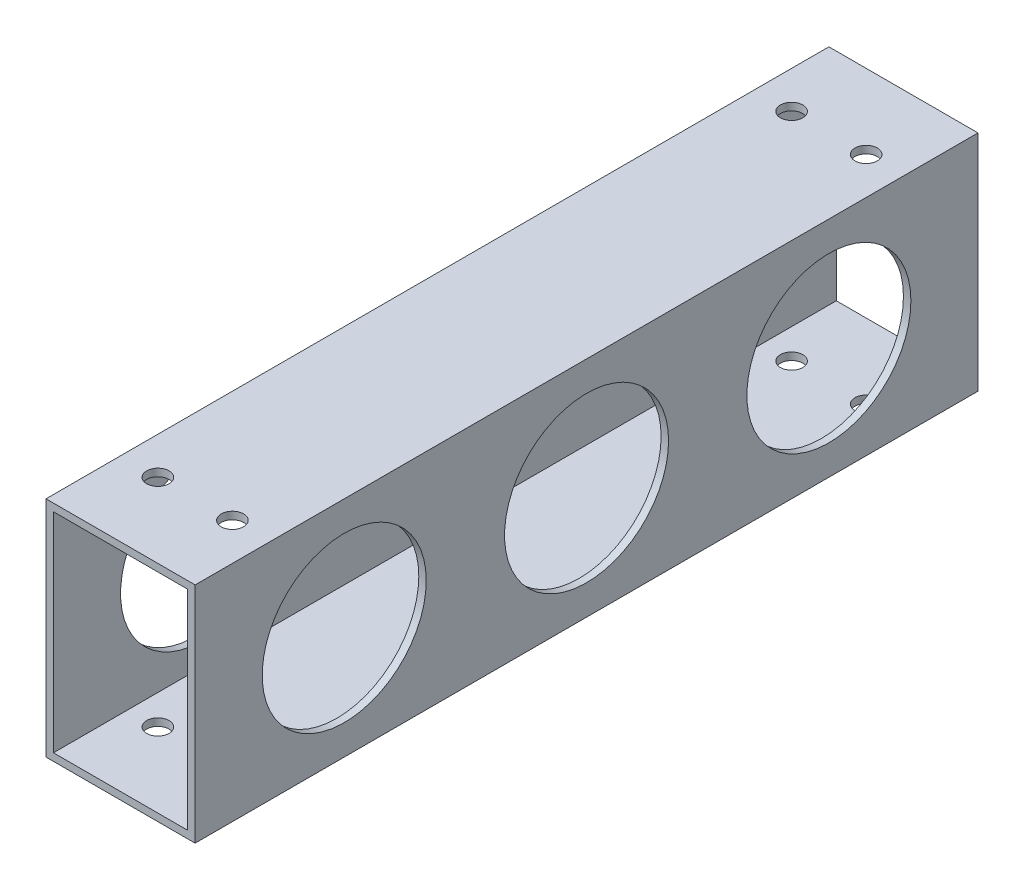
ISO-10303-21;
HEADER;
FILE_DESCRIPTION(('STEP AP214'),'2;1');
FILE_NAME('part.step','',(''),(''),'','','');
FILE_SCHEMA(('AUTOMOTIVE_DESIGN { 1 0 10303 214 1 1 1 1 }'));
ENDSEC;
DATA;
#1=APPLICATION_CONTEXT('core data for automotive mechanical design processes');
#2=APPLICATION_PROTOCOL_DEFINITION('international standard','automotive_design',2000,#1);
#3=PRODUCT_CONTEXT('',#1,'mechanical');
#4=PRODUCT('Part','Part','',(#3));
#5=PRODUCT_RELATED_PRODUCT_CATEGORY('part','',(#4));
#6=PRODUCT_DEFINITION_FORMATION('','',#4);
#7=PRODUCT_DEFINITION_CONTEXT('part definition',#1,'design');
#8=PRODUCT_DEFINITION('design','',#6,#7);
#9=PRODUCT_DEFINITION_SHAPE('','',#8);
#10=(LENGTH_UNIT() NAMED_UNIT(*) SI_UNIT(.MILLI.,.METRE.));
#11=(NAMED_UNIT(*) PLANE_ANGLE_UNIT() SI_UNIT($,.RADIAN.));
#12=(NAMED_UNIT(*) SI_UNIT($,.STERADIAN.) SOLID_ANGLE_UNIT());
#13=UNCERTAINTY_MEASURE_WITH_UNIT(LENGTH_MEASURE(1.E-05),#10,'distance_accuracy_value','');
#14=(GEOMETRIC_REPRESENTATION_CONTEXT(3) GLOBAL_UNCERTAINTY_ASSIGNED_CONTEXT((#13)) GLOBAL_UNIT_ASSIGNED_CONTEXT((#10,
#11,#12)) REPRESENTATION_CONTEXT('',''));
#15=CARTESIAN_POINT('',(0.,0.,0.));
#16=DIRECTION('',(0.,0.,1.));
#17=DIRECTION('',(1.,0.,0.));
#18=AXIS2_PLACEMENT_3D('',#15,#16,#17);
#19=CARTESIAN_POINT('',(0.,0.,105.));
#20=DIRECTION('',(0.,0.,1.));
#21=DIRECTION('',(1.,0.,0.));
#22=AXIS2_PLACEMENT_3D('',#19,#20,#21);
#23=PLANE('',#22);
#24=DIRECTION('',(0.,1.,0.));
#25=VECTOR('',#24,1.);
#26=CARTESIAN_POINT('',(9.99999999999999,-15.,105.));
#27=LINE('',#26,#25);
#28=CARTESIAN_POINT('',(9.99999999999999,-15.,105.));
#29=VERTEX_POINT('',#28);
#30=CARTESIAN_POINT('',(9.99999999999999,15.,105.));
#31=VERTEX_POINT('',#30);
#32=EDGE_CURVE('E173',#29,#31,#27,.T.);
#33=ORIENTED_EDGE('',*,*,#32,.T.);
#34=DIRECTION('',(-1.,0.,0.));
#35=VECTOR('',#34,1.);
#36=CARTESIAN_POINT('',(-10.,15.,105.));
#37=LINE('',#36,#35);
#38=CARTESIAN_POINT('',(-10.,15.,105.));
#39=VERTEX_POINT('',#38);
#40=EDGE_CURVE('E176',#31,#39,#37,.T.);
#41=ORIENTED_EDGE('',*,*,#40,.T.);
#42=DIRECTION('',(0.,-1.,0.));
#43=VECTOR('',#42,1.);
#44=CARTESIAN_POINT('',(-10.,-15.,105.));
#45=LINE('',#44,#43);
#46=CARTESIAN_POINT('',(-10.,-15.,105.));
#47=VERTEX_POINT('',#46);
#48=EDGE_CURVE('E179',#39,#47,#45,.T.);
#49=ORIENTED_EDGE('',*,*,#48,.T.);
#50=DIRECTION('',(1.,0.,0.));
#51=VECTOR('',#50,1.);
#52=CARTESIAN_POINT('',(-10.,-15.,105.));
#53=LINE('',#52,#51);
#54=EDGE_CURVE('E181',#47,#29,#53,.T.);
#55=ORIENTED_EDGE('',*,*,#54,.T.);
#56=EDGE_LOOP('',(#33,#41,#49,#55));
#57=FACE_BOUND('',#56,.T.);
#58=DIRECTION('',(-1.,0.,0.));
#59=VECTOR('',#58,1.);
#60=CARTESIAN_POINT('',(0.,14.,105.));
#61=LINE('',#60,#59);
#62=CARTESIAN_POINT('',(8.99999999999999,14.,105.));
#63=VERTEX_POINT('',#62);
#64=CARTESIAN_POINT('',(-9.00000000000001,14.,105.));
#65=VERTEX_POINT('',#64);
#66=EDGE_CURVE('E143',#63,#65,#61,.T.);
#67=ORIENTED_EDGE('',*,*,#66,.F.);
#68=DIRECTION('',(0.,1.,0.));
#69=VECTOR('',#68,1.);
#70=CARTESIAN_POINT('',(8.99999999999999,0.,105.));
#71=LINE('',#70,#69);
#72=CARTESIAN_POINT('',(8.99999999999999,-14.,105.));
#73=VERTEX_POINT('',#72);
#74=EDGE_CURVE('E135',#73,#63,#71,.T.);
#75=ORIENTED_EDGE('',*,*,#74,.F.);
#76=DIRECTION('',(1.,0.,0.));
#77=VECTOR('',#76,1.);
#78=CARTESIAN_POINT('',(0.,-14.,105.));
#79=LINE('',#78,#77);
#80=CARTESIAN_POINT('',(-9.00000000000001,-14.,105.));
#81=VERTEX_POINT('',#80);
#82=EDGE_CURVE('E157',#81,#73,#79,.T.);
#83=ORIENTED_EDGE('',*,*,#82,.F.);
#84=DIRECTION('',(0.,-1.,0.));
#85=VECTOR('',#84,1.);
#86=CARTESIAN_POINT('',(-9.00000000000001,0.,105.));
#87=LINE('',#86,#85);
#88=EDGE_CURVE('E155',#65,#81,#87,.T.);
#89=ORIENTED_EDGE('',*,*,#88,.F.);
#90=EDGE_LOOP('',(#67,#75,#83,#89));
#91=FACE_BOUND('',#90,.T.);
#92=ADVANCED_FACE('F68',(#57,#91),#23,.T.);
#93=CARTESIAN_POINT('',(0.,0.,0.));
#94=DIRECTION('',(0.,0.,1.));
#95=DIRECTION('',(1.,0.,0.));
#96=AXIS2_PLACEMENT_3D('',#93,#94,#95);
#97=PLANE('',#96);
#98=DIRECTION('',(0.,1.,0.));
#99=VECTOR('',#98,1.);
#100=CARTESIAN_POINT('',(9.99999999999999,-15.,0.));
#101=LINE('',#100,#99);
#102=CARTESIAN_POINT('',(9.99999999999999,-15.,0.));
#103=VERTEX_POINT('',#102);
#104=CARTESIAN_POINT('',(9.99999999999999,15.,0.));
#105=VERTEX_POINT('',#104);
#106=EDGE_CURVE('E151',#103,#105,#101,.T.);
#107=ORIENTED_EDGE('',*,*,#106,.F.);
#108=DIRECTION('',(1.,0.,0.));
#109=VECTOR('',#108,1.);
#110=CARTESIAN_POINT('',(-10.,-15.,0.));
#111=LINE('',#110,#109);
#112=CARTESIAN_POINT('',(-10.,-15.,0.));
#113=VERTEX_POINT('',#112);
#114=EDGE_CURVE('E177',#113,#103,#111,.T.);
#115=ORIENTED_EDGE('',*,*,#114,.F.);
#116=DIRECTION('',(0.,-1.,0.));
#117=VECTOR('',#116,1.);
#118=CARTESIAN_POINT('',(-10.,-15.,0.));
#119=LINE('',#118,#117);
#120=CARTESIAN_POINT('',(-10.,15.,0.));
#121=VERTEX_POINT('',#120);
#122=EDGE_CURVE('E188',#121,#113,#119,.T.);
#123=ORIENTED_EDGE('',*,*,#122,.F.);
#124=DIRECTION('',(-1.,0.,0.));
#125=VECTOR('',#124,1.);
#126=CARTESIAN_POINT('',(-10.,15.,0.));
#127=LINE('',#126,#125);
#128=EDGE_CURVE('E186',#105,#121,#127,.T.);
#129=ORIENTED_EDGE('',*,*,#128,.F.);
#130=EDGE_LOOP('',(#107,#115,#123,#129));
#131=FACE_BOUND('',#130,.T.);
#132=DIRECTION('',(0.,1.,0.));
#133=VECTOR('',#132,1.);
#134=CARTESIAN_POINT('',(8.99999999999999,0.,0.));
#135=LINE('',#134,#133);
#136=CARTESIAN_POINT('',(8.99999999999999,-14.,0.));
#137=VERTEX_POINT('',#136);
#138=CARTESIAN_POINT('',(8.99999999999999,14.,0.));
#139=VERTEX_POINT('',#138);
#140=EDGE_CURVE('E93',#137,#139,#135,.T.);
#141=ORIENTED_EDGE('',*,*,#140,.T.);
#142=DIRECTION('',(-1.,0.,0.));
#143=VECTOR('',#142,1.);
#144=CARTESIAN_POINT('',(0.,14.,0.));
#145=LINE('',#144,#143);
#146=CARTESIAN_POINT('',(-9.00000000000001,14.,0.));
#147=VERTEX_POINT('',#146);
#148=EDGE_CURVE('E150',#139,#147,#145,.T.);
#149=ORIENTED_EDGE('',*,*,#148,.T.);
#150=DIRECTION('',(0.,-1.,0.));
#151=VECTOR('',#150,1.);
#152=CARTESIAN_POINT('',(-9.00000000000001,0.,0.));
#153=LINE('',#152,#151);
#154=CARTESIAN_POINT('',(-9.00000000000001,-14.,0.));
#155=VERTEX_POINT('',#154);
#156=EDGE_CURVE('E165',#147,#155,#153,.T.);
#157=ORIENTED_EDGE('',*,*,#156,.T.);
#158=DIRECTION('',(1.,0.,0.));
#159=VECTOR('',#158,1.);
#160=CARTESIAN_POINT('',(0.,-14.,0.));
#161=LINE('',#160,#159);
#162=EDGE_CURVE('E144',#155,#137,#161,.T.);
#163=ORIENTED_EDGE('',*,*,#162,.T.);
#164=EDGE_LOOP('',(#141,#149,#157,#163));
#165=FACE_BOUND('',#164,.T.);
#166=ADVANCED_FACE('F303',(#131,#165),#97,.F.);
#167=CARTESIAN_POINT('',(9.99999999999999,-15.,105.));
#168=DIRECTION('',(-1.,0.,0.));
#169=DIRECTION('',(0.,0.,1.));
#170=AXIS2_PLACEMENT_3D('',#167,#168,#169);
#171=PLANE('',#170);
#172=CARTESIAN_POINT('',(9.99999999999999,0.,20.));
#173=DIRECTION('',(1.,0.,0.));
#174=DIRECTION('',(0.,0.,-1.));
#175=AXIS2_PLACEMENT_3D('',#172,#173,#174);
#176=CIRCLE('',#175,11.);
#177=CARTESIAN_POINT('',(9.99999999999999,0.,9.));
#178=VERTEX_POINT('',#177);
#179=EDGE_CURVE('E343',#178,#178,#176,.T.);
#180=ORIENTED_EDGE('',*,*,#179,.F.);
#181=EDGE_LOOP('',(#180));
#182=FACE_BOUND('',#181,.T.);
#183=CARTESIAN_POINT('',(9.99999999999999,0.,52.5));
#184=DIRECTION('',(1.,0.,0.));
#185=DIRECTION('',(0.,0.,-1.));
#186=AXIS2_PLACEMENT_3D('',#183,#184,#185);
#187=CIRCLE('',#186,11.);
#188=CARTESIAN_POINT('',(9.99999999999999,0.,41.5));
#189=VERTEX_POINT('',#188);
#190=EDGE_CURVE('E340',#189,#189,#187,.T.);
#191=ORIENTED_EDGE('',*,*,#190,.F.);
#192=EDGE_LOOP('',(#191));
#193=FACE_BOUND('',#192,.T.);
#194=CARTESIAN_POINT('',(9.99999999999999,0.,85.));
#195=DIRECTION('',(1.,0.,0.));
#196=DIRECTION('',(0.,0.,-1.));
#197=AXIS2_PLACEMENT_3D('',#194,#195,#196);
#198=CIRCLE('',#197,11.);
#199=CARTESIAN_POINT('',(9.99999999999999,0.,74.));
#200=VERTEX_POINT('',#199);
#201=EDGE_CURVE('E230',#200,#200,#198,.T.);
#202=ORIENTED_EDGE('',*,*,#201,.F.);
#203=EDGE_LOOP('',(#202));
#204=FACE_BOUND('',#203,.T.);
#205=ORIENTED_EDGE('',*,*,#106,.T.);
#206=DIRECTION('',(0.,0.,-1.));
#207=VECTOR('',#206,1.);
#208=CARTESIAN_POINT('',(9.99999999999999,15.,105.));
#209=LINE('',#208,#207);
#210=EDGE_CURVE('E12',#31,#105,#209,.T.);
#211=ORIENTED_EDGE('',*,*,#210,.F.);
#212=ORIENTED_EDGE('',*,*,#32,.F.);
#213=DIRECTION('',(0.,0.,-1.));
#214=VECTOR('',#213,1.);
#215=CARTESIAN_POINT('',(9.99999999999999,-15.,105.));
#216=LINE('',#215,#214);
#217=EDGE_CURVE('E183',#29,#103,#216,.T.);
#218=ORIENTED_EDGE('',*,*,#217,.T.);
#219=EDGE_LOOP('',(#205,#211,#212,#218));
#220=FACE_BOUND('',#219,.T.);
#221=ADVANCED_FACE('F70',(#182,#193,#204,#220),#171,.F.);
#222=CARTESIAN_POINT('',(-10.,15.,105.));
#223=DIRECTION('',(0.,-1.,0.));
#224=DIRECTION('',(0.,0.,-1.));
#225=AXIS2_PLACEMENT_3D('',#222,#223,#224);
#226=PLANE('',#225);
#227=CARTESIAN_POINT('',(-5.,15.,9.99999999999999));
#228=DIRECTION('',(0.,1.,0.));
#229=DIRECTION('',(0.,0.,1.));
#230=AXIS2_PLACEMENT_3D('',#227,#228,#229);
#231=CIRCLE('',#230,1.5);
#232=CARTESIAN_POINT('',(-5.,15.,11.5));
#233=VERTEX_POINT('',#232);
#234=EDGE_CURVE('E246',#233,#233,#231,.T.);
#235=ORIENTED_EDGE('',*,*,#234,.F.);
#236=EDGE_LOOP('',(#235));
#237=FACE_BOUND('',#236,.T.);
#238=CARTESIAN_POINT('',(5.,15.,95.));
#239=DIRECTION('',(0.,1.,0.));
#240=DIRECTION('',(0.,0.,1.));
#241=AXIS2_PLACEMENT_3D('',#238,#239,#240);
#242=CIRCLE('',#241,1.5);
#243=CARTESIAN_POINT('',(5.,15.,96.5));
#244=VERTEX_POINT('',#243);
#245=EDGE_CURVE('E247',#244,#244,#242,.T.);
#246=ORIENTED_EDGE('',*,*,#245,.F.);
#247=EDGE_LOOP('',(#246));
#248=FACE_BOUND('',#247,.T.);
#249=CARTESIAN_POINT('',(-5.,15.,95.));
#250=DIRECTION('',(0.,1.,0.));
#251=DIRECTION('',(0.,0.,1.));
#252=AXIS2_PLACEMENT_3D('',#249,#250,#251);
#253=CIRCLE('',#252,1.5);
#254=CARTESIAN_POINT('',(-5.,15.,96.5));
#255=VERTEX_POINT('',#254);
#256=EDGE_CURVE('E239',#255,#255,#253,.T.);
#257=ORIENTED_EDGE('',*,*,#256,.F.);
#258=EDGE_LOOP('',(#257));
#259=FACE_BOUND('',#258,.T.);
#260=CARTESIAN_POINT('',(5.,15.,9.99999999999999));
#261=DIRECTION('',(0.,1.,0.));
#262=DIRECTION('',(0.,0.,1.));
#263=AXIS2_PLACEMENT_3D('',#260,#261,#262);
#264=CIRCLE('',#263,1.5);
#265=CARTESIAN_POINT('',(5.,15.,11.5));
#266=VERTEX_POINT('',#265);
#267=EDGE_CURVE('E250',#266,#266,#264,.T.);
#268=ORIENTED_EDGE('',*,*,#267,.F.);
#269=EDGE_LOOP('',(#268));
#270=FACE_BOUND('',#269,.T.);
#271=ORIENTED_EDGE('',*,*,#128,.T.);
#272=DIRECTION('',(0.,0.,-1.));
#273=VECTOR('',#272,1.);
#274=CARTESIAN_POINT('',(-10.,15.,105.));
#275=LINE('',#274,#273);
#276=EDGE_CURVE('E77',#39,#121,#275,.T.);
#277=ORIENTED_EDGE('',*,*,#276,.F.);
#278=ORIENTED_EDGE('',*,*,#40,.F.);
#279=ORIENTED_EDGE('',*,*,#210,.T.);
#280=EDGE_LOOP('',(#271,#277,#278,#279));
#281=FACE_BOUND('',#280,.T.);
#282=ADVANCED_FACE('F289',(#237,#248,#259,#270,#281),#226,.F.);
#283=CARTESIAN_POINT('',(-10.,-15.,105.));
#284=DIRECTION('',(1.,0.,0.));
#285=DIRECTION('',(0.,0.,-1.));
#286=AXIS2_PLACEMENT_3D('',#283,#284,#285);
#287=PLANE('',#286);
#288=CARTESIAN_POINT('',(-10.,0.,20.));
#289=DIRECTION('',(1.,0.,0.));
#290=DIRECTION('',(0.,0.,-1.));
#291=AXIS2_PLACEMENT_3D('',#288,#289,#290);
#292=CIRCLE('',#291,11.);
#293=CARTESIAN_POINT('',(-10.,0.,9.));
#294=VERTEX_POINT('',#293);
#295=EDGE_CURVE('E217',#294,#294,#292,.F.);
#296=ORIENTED_EDGE('',*,*,#295,.F.);
#297=EDGE_LOOP('',(#296));
#298=FACE_BOUND('',#297,.T.);
#299=CARTESIAN_POINT('',(-10.,0.,52.5));
#300=DIRECTION('',(1.,0.,0.));
#301=DIRECTION('',(0.,0.,-1.));
#302=AXIS2_PLACEMENT_3D('',#299,#300,#301);
#303=CIRCLE('',#302,11.);
#304=CARTESIAN_POINT('',(-10.,0.,41.5));
#305=VERTEX_POINT('',#304);
#306=EDGE_CURVE('E333',#305,#305,#303,.F.);
#307=ORIENTED_EDGE('',*,*,#306,.F.);
#308=EDGE_LOOP('',(#307));
#309=FACE_BOUND('',#308,.T.);
#310=CARTESIAN_POINT('',(-10.,0.,85.));
#311=DIRECTION('',(1.,0.,0.));
#312=DIRECTION('',(0.,0.,-1.));
#313=AXIS2_PLACEMENT_3D('',#310,#311,#312);
#314=CIRCLE('',#313,11.);
#315=CARTESIAN_POINT('',(-10.,0.,74.));
#316=VERTEX_POINT('',#315);
#317=EDGE_CURVE('E336',#316,#316,#314,.F.);
#318=ORIENTED_EDGE('',*,*,#317,.F.);
#319=EDGE_LOOP('',(#318));
#320=FACE_BOUND('',#319,.T.);
#321=ORIENTED_EDGE('',*,*,#122,.T.);
#322=DIRECTION('',(0.,0.,-1.));
#323=VECTOR('',#322,1.);
#324=CARTESIAN_POINT('',(-10.,-15.,105.));
#325=LINE('',#324,#323);
#326=EDGE_CURVE('E193',#47,#113,#325,.T.);
#327=ORIENTED_EDGE('',*,*,#326,.F.);
#328=ORIENTED_EDGE('',*,*,#48,.F.);
#329=ORIENTED_EDGE('',*,*,#276,.T.);
#330=EDGE_LOOP('',(#321,#327,#328,#329));
#331=FACE_BOUND('',#330,.T.);
#332=ADVANCED_FACE('F292',(#298,#309,#320,#331),#287,.F.);
#333=CARTESIAN_POINT('',(-10.,-15.,105.));
#334=DIRECTION('',(0.,1.,0.));
#335=DIRECTION('',(0.,0.,1.));
#336=AXIS2_PLACEMENT_3D('',#333,#334,#335);
#337=PLANE('',#336);
#338=CARTESIAN_POINT('',(-5.,-15.,9.99999999999999));
#339=DIRECTION('',(0.,1.,0.));
#340=DIRECTION('',(0.,0.,1.));
#341=AXIS2_PLACEMENT_3D('',#338,#339,#340);
#342=CIRCLE('',#341,1.5);
#343=CARTESIAN_POINT('',(-5.,-15.,11.5));
#344=VERTEX_POINT('',#343);
#345=EDGE_CURVE('E243',#344,#344,#342,.F.);
#346=ORIENTED_EDGE('',*,*,#345,.F.);
#347=EDGE_LOOP('',(#346));
#348=FACE_BOUND('',#347,.T.);
#349=CARTESIAN_POINT('',(5.,-15.,95.));
#350=DIRECTION('',(0.,1.,0.));
#351=DIRECTION('',(0.,0.,1.));
#352=AXIS2_PLACEMENT_3D('',#349,#350,#351);
#353=CIRCLE('',#352,1.5);
#354=CARTESIAN_POINT('',(5.,-15.,96.5));
#355=VERTEX_POINT('',#354);
#356=EDGE_CURVE('E242',#355,#355,#353,.F.);
#357=ORIENTED_EDGE('',*,*,#356,.F.);
#358=EDGE_LOOP('',(#357));
#359=FACE_BOUND('',#358,.T.);
#360=CARTESIAN_POINT('',(-5.,-15.,95.));
#361=DIRECTION('',(0.,1.,0.));
#362=DIRECTION('',(0.,0.,1.));
#363=AXIS2_PLACEMENT_3D('',#360,#361,#362);
#364=CIRCLE('',#363,1.5);
#365=CARTESIAN_POINT('',(-5.,-15.,96.5));
#366=VERTEX_POINT('',#365);
#367=EDGE_CURVE('E236',#366,#366,#364,.F.);
#368=ORIENTED_EDGE('',*,*,#367,.F.);
#369=EDGE_LOOP('',(#368));
#370=FACE_BOUND('',#369,.T.);
#371=CARTESIAN_POINT('',(5.,-15.,9.99999999999999));
#372=DIRECTION('',(0.,1.,0.));
#373=DIRECTION('',(0.,0.,1.));
#374=AXIS2_PLACEMENT_3D('',#371,#372,#373);
#375=CIRCLE('',#374,1.5);
#376=CARTESIAN_POINT('',(5.,-15.,11.5));
#377=VERTEX_POINT('',#376);
#378=EDGE_CURVE('E202',#377,#377,#375,.F.);
#379=ORIENTED_EDGE('',*,*,#378,.F.);
#380=EDGE_LOOP('',(#379));
#381=FACE_BOUND('',#380,.T.);
#382=ORIENTED_EDGE('',*,*,#114,.T.);
#383=ORIENTED_EDGE('',*,*,#217,.F.);
#384=ORIENTED_EDGE('',*,*,#54,.F.);
#385=ORIENTED_EDGE('',*,*,#326,.T.);
#386=EDGE_LOOP('',(#382,#383,#384,#385));
#387=FACE_BOUND('',#386,.T.);
#388=ADVANCED_FACE('F307',(#348,#359,#370,#381,#387),#337,.F.);
#389=CARTESIAN_POINT('',(8.99999999999999,0.,105.));
#390=DIRECTION('',(-1.,0.,0.));
#391=DIRECTION('',(0.,0.,1.));
#392=AXIS2_PLACEMENT_3D('',#389,#390,#391);
#393=PLANE('',#392);
#394=CARTESIAN_POINT('',(8.99999999999999,0.,20.));
#395=DIRECTION('',(-1.,0.,0.));
#396=DIRECTION('',(0.,0.,1.));
#397=AXIS2_PLACEMENT_3D('',#394,#395,#396);
#398=CIRCLE('',#397,11.);
#399=CARTESIAN_POINT('',(8.99999999999999,0.,31.));
#400=VERTEX_POINT('',#399);
#401=EDGE_CURVE('E233',#400,#400,#398,.T.);
#402=ORIENTED_EDGE('',*,*,#401,.F.);
#403=EDGE_LOOP('',(#402));
#404=FACE_BOUND('',#403,.T.);
#405=CARTESIAN_POINT('',(8.99999999999999,0.,52.5));
#406=DIRECTION('',(-1.,0.,0.));
#407=DIRECTION('',(0.,0.,1.));
#408=AXIS2_PLACEMENT_3D('',#405,#406,#407);
#409=CIRCLE('',#408,11.);
#410=CARTESIAN_POINT('',(8.99999999999999,0.,63.5));
#411=VERTEX_POINT('',#410);
#412=EDGE_CURVE('E220',#411,#411,#409,.T.);
#413=ORIENTED_EDGE('',*,*,#412,.F.);
#414=EDGE_LOOP('',(#413));
#415=FACE_BOUND('',#414,.T.);
#416=CARTESIAN_POINT('',(8.99999999999999,0.,85.));
#417=DIRECTION('',(-1.,0.,0.));
#418=DIRECTION('',(0.,0.,1.));
#419=AXIS2_PLACEMENT_3D('',#416,#417,#418);
#420=CIRCLE('',#419,11.);
#421=CARTESIAN_POINT('',(8.99999999999999,0.,96.));
#422=VERTEX_POINT('',#421);
#423=EDGE_CURVE('E216',#422,#422,#420,.T.);
#424=ORIENTED_EDGE('',*,*,#423,.F.);
#425=EDGE_LOOP('',(#424));
#426=FACE_BOUND('',#425,.T.);
#427=ORIENTED_EDGE('',*,*,#140,.F.);
#428=DIRECTION('',(0.,0.,-1.));
#429=VECTOR('',#428,1.);
#430=CARTESIAN_POINT('',(8.99999999999999,-14.,105.));
#431=LINE('',#430,#429);
#432=EDGE_CURVE('E139',#73,#137,#431,.T.);
#433=ORIENTED_EDGE('',*,*,#432,.F.);
#434=ORIENTED_EDGE('',*,*,#74,.T.);
#435=DIRECTION('',(0.,0.,-1.));
#436=VECTOR('',#435,1.);
#437=CARTESIAN_POINT('',(8.99999999999999,14.,105.));
#438=LINE('',#437,#436);
#439=EDGE_CURVE('E138',#63,#139,#438,.T.);
#440=ORIENTED_EDGE('',*,*,#439,.T.);
#441=EDGE_LOOP('',(#427,#433,#434,#440));
#442=FACE_BOUND('',#441,.T.);
#443=ADVANCED_FACE('F137',(#404,#415,#426,#442),#393,.T.);
#444=CARTESIAN_POINT('',(0.,14.,105.));
#445=DIRECTION('',(0.,-1.,0.));
#446=DIRECTION('',(0.,0.,-1.));
#447=AXIS2_PLACEMENT_3D('',#444,#445,#446);
#448=PLANE('',#447);
#449=CARTESIAN_POINT('',(-5.,14.,9.99999999999999));
#450=DIRECTION('',(0.,-1.,0.));
#451=DIRECTION('',(0.,0.,-1.));
#452=AXIS2_PLACEMENT_3D('',#449,#450,#451);
#453=CIRCLE('',#452,1.5);
#454=CARTESIAN_POINT('',(-5.,14.,8.49999999999999));
#455=VERTEX_POINT('',#454);
#456=EDGE_CURVE('E163',#455,#455,#453,.T.);
#457=ORIENTED_EDGE('',*,*,#456,.F.);
#458=EDGE_LOOP('',(#457));
#459=FACE_BOUND('',#458,.T.);
#460=CARTESIAN_POINT('',(5.,14.,95.));
#461=DIRECTION('',(0.,-1.,0.));
#462=DIRECTION('',(0.,0.,-1.));
#463=AXIS2_PLACEMENT_3D('',#460,#461,#462);
#464=CIRCLE('',#463,1.5);
#465=CARTESIAN_POINT('',(5.,14.,93.5));
#466=VERTEX_POINT('',#465);
#467=EDGE_CURVE('E210',#466,#466,#464,.T.);
#468=ORIENTED_EDGE('',*,*,#467,.F.);
#469=EDGE_LOOP('',(#468));
#470=FACE_BOUND('',#469,.T.);
#471=CARTESIAN_POINT('',(-5.,14.,95.));
#472=DIRECTION('',(0.,-1.,0.));
#473=DIRECTION('',(0.,0.,-1.));
#474=AXIS2_PLACEMENT_3D('',#471,#472,#473);
#475=CIRCLE('',#474,1.5);
#476=CARTESIAN_POINT('',(-5.,14.,93.5));
#477=VERTEX_POINT('',#476);
#478=EDGE_CURVE('E206',#477,#477,#475,.T.);
#479=ORIENTED_EDGE('',*,*,#478,.F.);
#480=EDGE_LOOP('',(#479));
#481=FACE_BOUND('',#480,.T.);
#482=CARTESIAN_POINT('',(5.,14.,9.99999999999999));
#483=DIRECTION('',(0.,-1.,0.));
#484=DIRECTION('',(0.,0.,-1.));
#485=AXIS2_PLACEMENT_3D('',#482,#483,#484);
#486=CIRCLE('',#485,1.5);
#487=CARTESIAN_POINT('',(5.,14.,8.49999999999999));
#488=VERTEX_POINT('',#487);
#489=EDGE_CURVE('E201',#488,#488,#486,.T.);
#490=ORIENTED_EDGE('',*,*,#489,.F.);
#491=EDGE_LOOP('',(#490));
#492=FACE_BOUND('',#491,.T.);
#493=ORIENTED_EDGE('',*,*,#148,.F.);
#494=ORIENTED_EDGE('',*,*,#439,.F.);
#495=ORIENTED_EDGE('',*,*,#66,.T.);
#496=DIRECTION('',(0.,0.,-1.));
#497=VECTOR('',#496,1.);
#498=CARTESIAN_POINT('',(-9.00000000000001,14.,105.));
#499=LINE('',#498,#497);
#500=EDGE_CURVE('E152',#65,#147,#499,.T.);
#501=ORIENTED_EDGE('',*,*,#500,.T.);
#502=EDGE_LOOP('',(#493,#494,#495,#501));
#503=FACE_BOUND('',#502,.T.);
#504=ADVANCED_FACE('F147',(#459,#470,#481,#492,#503),#448,.T.);
#505=CARTESIAN_POINT('',(-9.00000000000001,0.,105.));
#506=DIRECTION('',(1.,0.,0.));
#507=DIRECTION('',(0.,0.,-1.));
#508=AXIS2_PLACEMENT_3D('',#505,#506,#507);
#509=PLANE('',#508);
#510=CARTESIAN_POINT('',(-9.,0.,20.));
#511=DIRECTION('',(1.,0.,0.));
#512=DIRECTION('',(0.,0.,-1.));
#513=AXIS2_PLACEMENT_3D('',#510,#511,#512);
#514=CIRCLE('',#513,11.);
#515=CARTESIAN_POINT('',(-9.,0.,9.));
#516=VERTEX_POINT('',#515);
#517=EDGE_CURVE('E72',#516,#516,#514,.T.);
#518=ORIENTED_EDGE('',*,*,#517,.F.);
#519=EDGE_LOOP('',(#518));
#520=FACE_BOUND('',#519,.T.);
#521=CARTESIAN_POINT('',(-9.,0.,52.5));
#522=DIRECTION('',(1.,0.,0.));
#523=DIRECTION('',(0.,0.,-1.));
#524=AXIS2_PLACEMENT_3D('',#521,#522,#523);
#525=CIRCLE('',#524,11.);
#526=CARTESIAN_POINT('',(-9.,0.,41.5));
#527=VERTEX_POINT('',#526);
#528=EDGE_CURVE('E218',#527,#527,#525,.T.);
#529=ORIENTED_EDGE('',*,*,#528,.F.);
#530=EDGE_LOOP('',(#529));
#531=FACE_BOUND('',#530,.T.);
#532=CARTESIAN_POINT('',(-9.,0.,85.));
#533=DIRECTION('',(1.,0.,0.));
#534=DIRECTION('',(0.,0.,-1.));
#535=AXIS2_PLACEMENT_3D('',#532,#533,#534);
#536=CIRCLE('',#535,11.);
#537=CARTESIAN_POINT('',(-9.,0.,74.));
#538=VERTEX_POINT('',#537);
#539=EDGE_CURVE('E214',#538,#538,#536,.T.);
#540=ORIENTED_EDGE('',*,*,#539,.F.);
#541=EDGE_LOOP('',(#540));
#542=FACE_BOUND('',#541,.T.);
#543=ORIENTED_EDGE('',*,*,#156,.F.);
#544=ORIENTED_EDGE('',*,*,#500,.F.);
#545=ORIENTED_EDGE('',*,*,#88,.T.);
#546=DIRECTION('',(0.,0.,-1.));
#547=VECTOR('',#546,1.);
#548=CARTESIAN_POINT('',(-9.00000000000001,-14.,105.));
#549=LINE('',#548,#547);
#550=EDGE_CURVE('E85',#81,#155,#549,.T.);
#551=ORIENTED_EDGE('',*,*,#550,.T.);
#552=EDGE_LOOP('',(#543,#544,#545,#551));
#553=FACE_BOUND('',#552,.T.);
#554=ADVANCED_FACE('F272',(#520,#531,#542,#553),#509,.T.);
#555=CARTESIAN_POINT('',(0.,-14.,105.));
#556=DIRECTION('',(0.,1.,0.));
#557=DIRECTION('',(0.,0.,1.));
#558=AXIS2_PLACEMENT_3D('',#555,#556,#557);
#559=PLANE('',#558);
#560=CARTESIAN_POINT('',(-5.,-14.,9.99999999999999));
#561=DIRECTION('',(0.,1.,0.));
#562=DIRECTION('',(0.,0.,1.));
#563=AXIS2_PLACEMENT_3D('',#560,#561,#562);
#564=CIRCLE('',#563,1.5);
#565=CARTESIAN_POINT('',(-5.,-14.,11.5));
#566=VERTEX_POINT('',#565);
#567=EDGE_CURVE('E211',#566,#566,#564,.T.);
#568=ORIENTED_EDGE('',*,*,#567,.F.);
#569=EDGE_LOOP('',(#568));
#570=FACE_BOUND('',#569,.T.);
#571=CARTESIAN_POINT('',(5.,-14.,95.));
#572=DIRECTION('',(0.,1.,0.));
#573=DIRECTION('',(0.,0.,1.));
#574=AXIS2_PLACEMENT_3D('',#571,#572,#573);
#575=CIRCLE('',#574,1.5);
#576=CARTESIAN_POINT('',(5.,-14.,96.5));
#577=VERTEX_POINT('',#576);
#578=EDGE_CURVE('E207',#577,#577,#575,.T.);
#579=ORIENTED_EDGE('',*,*,#578,.F.);
#580=EDGE_LOOP('',(#579));
#581=FACE_BOUND('',#580,.T.);
#582=CARTESIAN_POINT('',(-5.,-14.,95.));
#583=DIRECTION('',(0.,1.,0.));
#584=DIRECTION('',(0.,0.,1.));
#585=AXIS2_PLACEMENT_3D('',#582,#583,#584);
#586=CIRCLE('',#585,1.5);
#587=CARTESIAN_POINT('',(-5.,-14.,96.5));
#588=VERTEX_POINT('',#587);
#589=EDGE_CURVE('E203',#588,#588,#586,.T.);
#590=ORIENTED_EDGE('',*,*,#589,.F.);
#591=EDGE_LOOP('',(#590));
#592=FACE_BOUND('',#591,.T.);
#593=CARTESIAN_POINT('',(5.,-14.,9.99999999999999));
#594=DIRECTION('',(0.,1.,0.));
#595=DIRECTION('',(0.,0.,1.));
#596=AXIS2_PLACEMENT_3D('',#593,#594,#595);
#597=CIRCLE('',#596,1.5);
#598=CARTESIAN_POINT('',(5.,-14.,11.5));
#599=VERTEX_POINT('',#598);
#600=EDGE_CURVE('E198',#599,#599,#597,.T.);
#601=ORIENTED_EDGE('',*,*,#600,.F.);
#602=EDGE_LOOP('',(#601));
#603=FACE_BOUND('',#602,.T.);
#604=ORIENTED_EDGE('',*,*,#162,.F.);
#605=ORIENTED_EDGE('',*,*,#550,.F.);
#606=ORIENTED_EDGE('',*,*,#82,.T.);
#607=ORIENTED_EDGE('',*,*,#432,.T.);
#608=EDGE_LOOP('',(#604,#605,#606,#607));
#609=FACE_BOUND('',#608,.T.);
#610=ADVANCED_FACE('F385',(#570,#581,#592,#603,#609),#559,.T.);
#611=CARTESIAN_POINT('',(5.,-19.2426406871193,9.99999999999999));
#612=DIRECTION('',(0.,1.,0.));
#613=DIRECTION('',(0.,0.,1.));
#614=AXIS2_PLACEMENT_3D('',#611,#612,#613);
#615=CYLINDRICAL_SURFACE('',#614,1.5);
#616=ORIENTED_EDGE('',*,*,#600,.T.);
#617=EDGE_LOOP('',(#616));
#618=FACE_BOUND('',#617,.T.);
#619=ORIENTED_EDGE('',*,*,#378,.T.);
#620=EDGE_LOOP('',(#619));
#621=FACE_BOUND('',#620,.T.);
#622=ADVANCED_FACE('F286',(#618,#621),#615,.F.);
#623=CARTESIAN_POINT('',(-5.,-19.2426406871193,95.));
#624=DIRECTION('',(0.,1.,0.));
#625=DIRECTION('',(0.,0.,1.));
#626=AXIS2_PLACEMENT_3D('',#623,#624,#625);
#627=CYLINDRICAL_SURFACE('',#626,1.5);
#628=ORIENTED_EDGE('',*,*,#589,.T.);
#629=EDGE_LOOP('',(#628));
#630=FACE_BOUND('',#629,.T.);
#631=ORIENTED_EDGE('',*,*,#367,.T.);
#632=EDGE_LOOP('',(#631));
#633=FACE_BOUND('',#632,.T.);
#634=ADVANCED_FACE('F395',(#630,#633),#627,.F.);
#635=CARTESIAN_POINT('',(5.,-19.2426406871193,95.));
#636=DIRECTION('',(0.,1.,0.));
#637=DIRECTION('',(0.,0.,1.));
#638=AXIS2_PLACEMENT_3D('',#635,#636,#637);
#639=CYLINDRICAL_SURFACE('',#638,1.5);
#640=ORIENTED_EDGE('',*,*,#578,.T.);
#641=EDGE_LOOP('',(#640));
#642=FACE_BOUND('',#641,.T.);
#643=ORIENTED_EDGE('',*,*,#356,.T.);
#644=EDGE_LOOP('',(#643));
#645=FACE_BOUND('',#644,.T.);
#646=ADVANCED_FACE('F400',(#642,#645),#639,.F.);
#647=CARTESIAN_POINT('',(-5.,-19.2426406871193,9.99999999999999));
#648=DIRECTION('',(0.,1.,0.));
#649=DIRECTION('',(0.,0.,1.));
#650=AXIS2_PLACEMENT_3D('',#647,#648,#649);
#651=CYLINDRICAL_SURFACE('',#650,1.5);
#652=ORIENTED_EDGE('',*,*,#567,.T.);
#653=EDGE_LOOP('',(#652));
#654=FACE_BOUND('',#653,.T.);
#655=ORIENTED_EDGE('',*,*,#345,.T.);
#656=EDGE_LOOP('',(#655));
#657=FACE_BOUND('',#656,.T.);
#658=ADVANCED_FACE('F284',(#654,#657),#651,.F.);
#659=ORIENTED_EDGE('',*,*,#489,.T.);
#660=EDGE_LOOP('',(#659));
#661=FACE_BOUND('',#660,.T.);
#662=ORIENTED_EDGE('',*,*,#267,.T.);
#663=EDGE_LOOP('',(#662));
#664=FACE_BOUND('',#663,.T.);
#665=ADVANCED_FACE('F280',(#661,#664),#615,.F.);
#666=ORIENTED_EDGE('',*,*,#478,.T.);
#667=EDGE_LOOP('',(#666));
#668=FACE_BOUND('',#667,.T.);
#669=ORIENTED_EDGE('',*,*,#256,.T.);
#670=EDGE_LOOP('',(#669));
#671=FACE_BOUND('',#670,.T.);
#672=ADVANCED_FACE('F283',(#668,#671),#627,.F.);
#673=ORIENTED_EDGE('',*,*,#467,.T.);
#674=EDGE_LOOP('',(#673));
#675=FACE_BOUND('',#674,.T.);
#676=ORIENTED_EDGE('',*,*,#245,.T.);
#677=EDGE_LOOP('',(#676));
#678=FACE_BOUND('',#677,.T.);
#679=ADVANCED_FACE('F379',(#675,#678),#639,.F.);
#680=ORIENTED_EDGE('',*,*,#456,.T.);
#681=EDGE_LOOP('',(#680));
#682=FACE_BOUND('',#681,.T.);
#683=ORIENTED_EDGE('',*,*,#234,.T.);
#684=EDGE_LOOP('',(#683));
#685=FACE_BOUND('',#684,.T.);
#686=ADVANCED_FACE('F267',(#682,#685),#651,.F.);
#687=CARTESIAN_POINT('',(-41.1126983722081,0.,85.));
#688=DIRECTION('',(1.,0.,0.));
#689=DIRECTION('',(0.,0.,-1.));
#690=AXIS2_PLACEMENT_3D('',#687,#688,#689);
#691=CYLINDRICAL_SURFACE('',#690,11.);
#692=ORIENTED_EDGE('',*,*,#539,.T.);
#693=EDGE_LOOP('',(#692));
#694=FACE_BOUND('',#693,.T.);
#695=ORIENTED_EDGE('',*,*,#317,.T.);
#696=EDGE_LOOP('',(#695));
#697=FACE_BOUND('',#696,.T.);
#698=ADVANCED_FACE('F362',(#694,#697),#691,.F.);
#699=CARTESIAN_POINT('',(-41.1126983722081,0.,52.5));
#700=DIRECTION('',(1.,0.,0.));
#701=DIRECTION('',(0.,0.,-1.));
#702=AXIS2_PLACEMENT_3D('',#699,#700,#701);
#703=CYLINDRICAL_SURFACE('',#702,11.);
#704=ORIENTED_EDGE('',*,*,#528,.T.);
#705=EDGE_LOOP('',(#704));
#706=FACE_BOUND('',#705,.T.);
#707=ORIENTED_EDGE('',*,*,#306,.T.);
#708=EDGE_LOOP('',(#707));
#709=FACE_BOUND('',#708,.T.);
#710=ADVANCED_FACE('F369',(#706,#709),#703,.F.);
#711=CARTESIAN_POINT('',(-41.1126983722081,0.,20.));
#712=DIRECTION('',(1.,0.,0.));
#713=DIRECTION('',(0.,0.,-1.));
#714=AXIS2_PLACEMENT_3D('',#711,#712,#713);
#715=CYLINDRICAL_SURFACE('',#714,11.);
#716=ORIENTED_EDGE('',*,*,#517,.T.);
#717=EDGE_LOOP('',(#716));
#718=FACE_BOUND('',#717,.T.);
#719=ORIENTED_EDGE('',*,*,#295,.T.);
#720=EDGE_LOOP('',(#719));
#721=FACE_BOUND('',#720,.T.);
#722=ADVANCED_FACE('F360',(#718,#721),#715,.F.);
#723=ORIENTED_EDGE('',*,*,#423,.T.);
#724=EDGE_LOOP('',(#723));
#725=FACE_BOUND('',#724,.T.);
#726=ORIENTED_EDGE('',*,*,#201,.T.);
#727=EDGE_LOOP('',(#726));
#728=FACE_BOUND('',#727,.T.);
#729=ADVANCED_FACE('F357',(#725,#728),#691,.F.);
#730=ORIENTED_EDGE('',*,*,#412,.T.);
#731=EDGE_LOOP('',(#730));
#732=FACE_BOUND('',#731,.T.);
#733=ORIENTED_EDGE('',*,*,#190,.T.);
#734=EDGE_LOOP('',(#733));
#735=FACE_BOUND('',#734,.T.);
#736=ADVANCED_FACE('F359',(#732,#735),#703,.F.);
#737=ORIENTED_EDGE('',*,*,#401,.T.);
#738=EDGE_LOOP('',(#737));
#739=FACE_BOUND('',#738,.T.);
#740=ORIENTED_EDGE('',*,*,#179,.T.);
#741=EDGE_LOOP('',(#740));
#742=FACE_BOUND('',#741,.T.);
#743=ADVANCED_FACE('F349',(#739,#742),#715,.F.);
#744=CLOSED_SHELL('',(#92,#166,#221,#282,#332,#388,#443,#504,#554,#610,#622,#634,#646,#658,#665,
#672,#679,#686,#698,#710,#722,#729,#736,#743));
#745=MANIFOLD_SOLID_BREP('B2',#744);
#746=ADVANCED_BREP_SHAPE_REPRESENTATION('',(#18,#745),#14);
#747=SHAPE_DEFINITION_REPRESENTATION(#9,#746);
ENDSEC;
END-ISO-10303-21;
